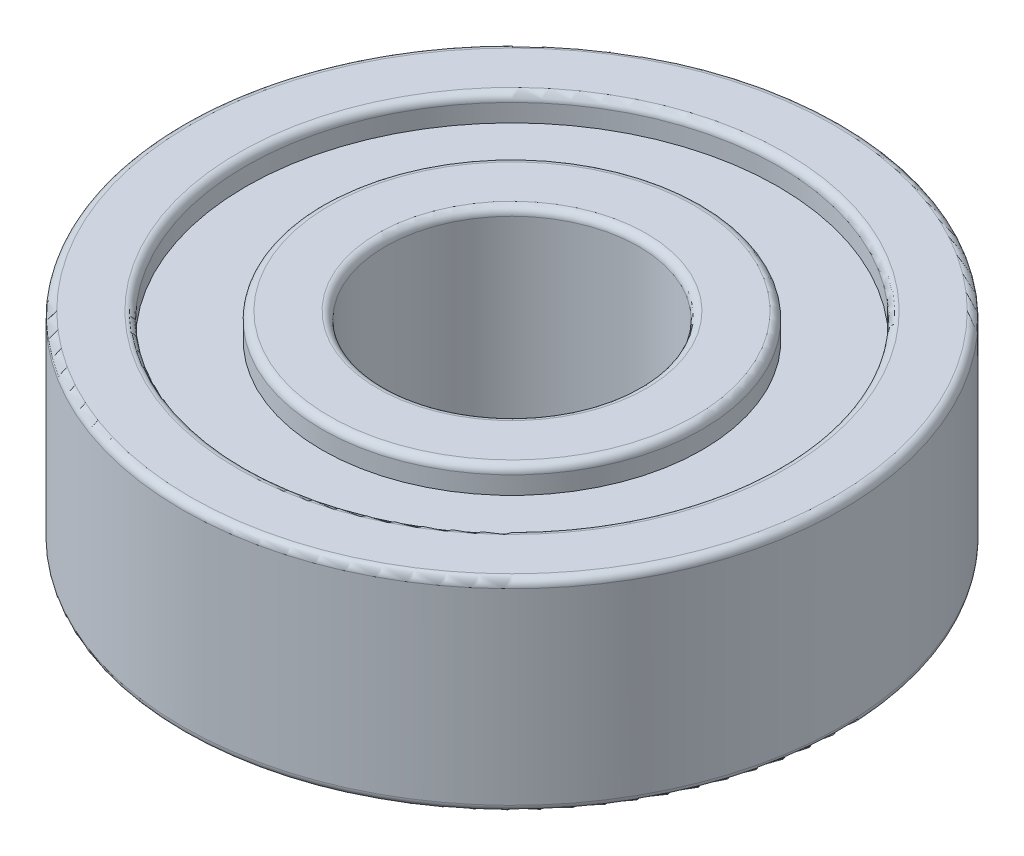
ISO-10303-21;
HEADER;
FILE_DESCRIPTION(('STEP AP214'),'2;1');
FILE_NAME('part.step','',(''),(''),'','','');
FILE_SCHEMA(('AUTOMOTIVE_DESIGN { 1 0 10303 214 1 1 1 1 }'));
ENDSEC;
DATA;
#1=APPLICATION_CONTEXT('core data for automotive mechanical design processes');
#2=APPLICATION_PROTOCOL_DEFINITION('international standard','automotive_design',2000,#1);
#3=PRODUCT_CONTEXT('',#1,'mechanical');
#4=PRODUCT('Part','Part','',(#3));
#5=PRODUCT_RELATED_PRODUCT_CATEGORY('part','',(#4));
#6=PRODUCT_DEFINITION_FORMATION('','',#4);
#7=PRODUCT_DEFINITION_CONTEXT('part definition',#1,'design');
#8=PRODUCT_DEFINITION('design','',#6,#7);
#9=PRODUCT_DEFINITION_SHAPE('','',#8);
#10=(LENGTH_UNIT() NAMED_UNIT(*) SI_UNIT(.MILLI.,.METRE.));
#11=(NAMED_UNIT(*) PLANE_ANGLE_UNIT() SI_UNIT($,.RADIAN.));
#12=(NAMED_UNIT(*) SI_UNIT($,.STERADIAN.) SOLID_ANGLE_UNIT());
#13=UNCERTAINTY_MEASURE_WITH_UNIT(LENGTH_MEASURE(1.E-05),#10,'distance_accuracy_value','');
#14=(GEOMETRIC_REPRESENTATION_CONTEXT(3) GLOBAL_UNCERTAINTY_ASSIGNED_CONTEXT((#13)) GLOBAL_UNIT_ASSIGNED_CONTEXT((#10,
#11,#12)) REPRESENTATION_CONTEXT('',''));
#15=CARTESIAN_POINT('',(0.,0.,0.));
#16=DIRECTION('',(0.,0.,1.));
#17=DIRECTION('',(1.,0.,0.));
#18=AXIS2_PLACEMENT_3D('',#15,#16,#17);
#19=CARTESIAN_POINT('',(7.5,8.,0.));
#20=DIRECTION('',(0.,-1.,0.));
#21=DIRECTION('',(0.,0.,-1.));
#22=AXIS2_PLACEMENT_3D('',#19,#20,#21);
#23=PLANE('',#22);
#24=CARTESIAN_POINT('',(0.,8.,0.));
#25=DIRECTION('',(0.,-1.,0.));
#26=DIRECTION('',(0.,0.,-1.));
#27=AXIS2_PLACEMENT_3D('',#24,#25,#26);
#28=CIRCLE('',#27,7.2);
#29=CARTESIAN_POINT('',(0.,8.,-7.2));
#30=VERTEX_POINT('',#29);
#31=EDGE_CURVE('E55',#30,#30,#28,.F.);
#32=ORIENTED_EDGE('',*,*,#31,.T.);
#33=EDGE_LOOP('',(#32));
#34=FACE_BOUND('',#33,.T.);
#35=CARTESIAN_POINT('',(0.,8.,0.));
#36=DIRECTION('',(0.,-1.,0.));
#37=DIRECTION('',(0.,0.,-1.));
#38=AXIS2_PLACEMENT_3D('',#35,#36,#37);
#39=CIRCLE('',#38,5.3);
#40=CARTESIAN_POINT('',(0.,8.,-5.3));
#41=VERTEX_POINT('',#40);
#42=EDGE_CURVE('E58',#41,#41,#39,.T.);
#43=ORIENTED_EDGE('',*,*,#42,.T.);
#44=EDGE_LOOP('',(#43));
#45=FACE_BOUND('',#44,.T.);
#46=ADVANCED_FACE('F35',(#34,#45),#23,.F.);
#47=CARTESIAN_POINT('',(0.,4.61129603751149,0.));
#48=DIRECTION('',(0.,1.,0.));
#49=DIRECTION('',(0.,0.,1.));
#50=AXIS2_PLACEMENT_3D('',#47,#48,#49);
#51=CYLINDRICAL_SURFACE('',#50,5.);
#52=CARTESIAN_POINT('',(0.,0.3,0.));
#53=DIRECTION('',(0.,1.,0.));
#54=DIRECTION('',(0.,0.,1.));
#55=AXIS2_PLACEMENT_3D('',#52,#53,#54);
#56=CIRCLE('',#55,5.);
#57=CARTESIAN_POINT('',(0.,0.3,5.));
#58=VERTEX_POINT('',#57);
#59=EDGE_CURVE('E79',#58,#58,#56,.F.);
#60=ORIENTED_EDGE('',*,*,#59,.T.);
#61=EDGE_LOOP('',(#60));
#62=FACE_BOUND('',#61,.T.);
#63=CARTESIAN_POINT('',(0.,7.7,0.));
#64=DIRECTION('',(0.,-1.,0.));
#65=DIRECTION('',(0.,0.,-1.));
#66=AXIS2_PLACEMENT_3D('',#63,#64,#65);
#67=CIRCLE('',#66,5.);
#68=CARTESIAN_POINT('',(0.,7.7,-5.));
#69=VERTEX_POINT('',#68);
#70=EDGE_CURVE('E82',#69,#69,#67,.F.);
#71=ORIENTED_EDGE('',*,*,#70,.T.);
#72=EDGE_LOOP('',(#71));
#73=FACE_BOUND('',#72,.T.);
#74=ADVANCED_FACE('F122',(#62,#73),#51,.F.);
#75=CARTESIAN_POINT('',(5.,0.,0.));
#76=DIRECTION('',(0.,1.,0.));
#77=DIRECTION('',(0.,0.,1.));
#78=AXIS2_PLACEMENT_3D('',#75,#76,#77);
#79=PLANE('',#78);
#80=CARTESIAN_POINT('',(0.,0.,0.));
#81=DIRECTION('',(0.,1.,0.));
#82=DIRECTION('',(0.,0.,1.));
#83=AXIS2_PLACEMENT_3D('',#80,#81,#82);
#84=CIRCLE('',#83,5.3);
#85=CARTESIAN_POINT('',(0.,0.,5.3));
#86=VERTEX_POINT('',#85);
#87=EDGE_CURVE('E85',#86,#86,#84,.T.);
#88=ORIENTED_EDGE('',*,*,#87,.T.);
#89=EDGE_LOOP('',(#88));
#90=FACE_BOUND('',#89,.T.);
#91=CARTESIAN_POINT('',(0.,0.,0.));
#92=DIRECTION('',(0.,1.,0.));
#93=DIRECTION('',(0.,0.,1.));
#94=AXIS2_PLACEMENT_3D('',#91,#92,#93);
#95=CIRCLE('',#94,7.2);
#96=CARTESIAN_POINT('',(0.,0.,7.2));
#97=VERTEX_POINT('',#96);
#98=EDGE_CURVE('E88',#97,#97,#95,.F.);
#99=ORIENTED_EDGE('',*,*,#98,.T.);
#100=EDGE_LOOP('',(#99));
#101=FACE_BOUND('',#100,.T.);
#102=ADVANCED_FACE('F128',(#90,#101),#79,.F.);
#103=CARTESIAN_POINT('',(0.,4.61129603751149,0.));
#104=DIRECTION('',(0.,1.,0.));
#105=DIRECTION('',(0.,0.,1.));
#106=AXIS2_PLACEMENT_3D('',#103,#104,#105);
#107=CYLINDRICAL_SURFACE('',#106,7.5);
#108=CARTESIAN_POINT('',(0.,0.3,0.));
#109=DIRECTION('',(0.,1.,0.));
#110=DIRECTION('',(0.,0.,1.));
#111=AXIS2_PLACEMENT_3D('',#108,#109,#110);
#112=CIRCLE('',#111,7.5);
#113=CARTESIAN_POINT('',(0.,0.3,7.5));
#114=VERTEX_POINT('',#113);
#115=EDGE_CURVE('E76',#114,#114,#112,.T.);
#116=ORIENTED_EDGE('',*,*,#115,.T.);
#117=EDGE_LOOP('',(#116));
#118=FACE_BOUND('',#117,.T.);
#119=CARTESIAN_POINT('',(0.,1.,0.));
#120=DIRECTION('',(0.,1.,0.));
#121=DIRECTION('',(0.,0.,1.));
#122=AXIS2_PLACEMENT_3D('',#119,#120,#121);
#123=CIRCLE('',#122,7.5);
#124=CARTESIAN_POINT('',(0.,1.,7.5));
#125=VERTEX_POINT('',#124);
#126=EDGE_CURVE('E91',#125,#125,#123,.T.);
#127=ORIENTED_EDGE('',*,*,#126,.F.);
#128=EDGE_LOOP('',(#127));
#129=FACE_BOUND('',#128,.T.);
#130=ADVANCED_FACE('F184',(#118,#129),#107,.T.);
#131=CARTESIAN_POINT('',(7.5,1.,0.));
#132=DIRECTION('',(0.,1.,0.));
#133=DIRECTION('',(0.,0.,1.));
#134=AXIS2_PLACEMENT_3D('',#131,#132,#133);
#135=PLANE('',#134);
#136=CARTESIAN_POINT('',(0.,1.,0.));
#137=DIRECTION('',(0.,1.,0.));
#138=DIRECTION('',(0.,0.,1.));
#139=AXIS2_PLACEMENT_3D('',#136,#137,#138);
#140=CIRCLE('',#139,10.5);
#141=CARTESIAN_POINT('',(0.,1.,10.5));
#142=VERTEX_POINT('',#141);
#143=EDGE_CURVE('E94',#142,#142,#140,.T.);
#144=ORIENTED_EDGE('',*,*,#143,.F.);
#145=EDGE_LOOP('',(#144));
#146=FACE_BOUND('',#145,.T.);
#147=ORIENTED_EDGE('',*,*,#126,.T.);
#148=EDGE_LOOP('',(#147));
#149=FACE_BOUND('',#148,.T.);
#150=ADVANCED_FACE('F180',(#146,#149),#135,.F.);
#151=CARTESIAN_POINT('',(0.,4.61129603751149,0.));
#152=DIRECTION('',(0.,1.,0.));
#153=DIRECTION('',(0.,0.,1.));
#154=AXIS2_PLACEMENT_3D('',#151,#152,#153);
#155=CYLINDRICAL_SURFACE('',#154,10.5);
#156=CARTESIAN_POINT('',(0.,0.3,0.));
#157=DIRECTION('',(0.,1.,0.));
#158=DIRECTION('',(0.,0.,1.));
#159=AXIS2_PLACEMENT_3D('',#156,#157,#158);
#160=CIRCLE('',#159,10.5);
#161=CARTESIAN_POINT('',(0.,0.3,10.5));
#162=VERTEX_POINT('',#161);
#163=EDGE_CURVE('E67',#162,#162,#160,.F.);
#164=ORIENTED_EDGE('',*,*,#163,.T.);
#165=EDGE_LOOP('',(#164));
#166=FACE_BOUND('',#165,.T.);
#167=ORIENTED_EDGE('',*,*,#143,.T.);
#168=EDGE_LOOP('',(#167));
#169=FACE_BOUND('',#168,.T.);
#170=ADVANCED_FACE('F174',(#166,#169),#155,.F.);
#171=CARTESIAN_POINT('',(10.5,0.,0.));
#172=DIRECTION('',(0.,1.,0.));
#173=DIRECTION('',(0.,0.,1.));
#174=AXIS2_PLACEMENT_3D('',#171,#172,#173);
#175=PLANE('',#174);
#176=CARTESIAN_POINT('',(0.,0.,0.));
#177=DIRECTION('',(0.,1.,0.));
#178=DIRECTION('',(0.,0.,1.));
#179=AXIS2_PLACEMENT_3D('',#176,#177,#178);
#180=CIRCLE('',#179,10.8);
#181=CARTESIAN_POINT('',(0.,0.,10.8));
#182=VERTEX_POINT('',#181);
#183=EDGE_CURVE('E70',#182,#182,#180,.T.);
#184=ORIENTED_EDGE('',*,*,#183,.T.);
#185=EDGE_LOOP('',(#184));
#186=FACE_BOUND('',#185,.T.);
#187=CARTESIAN_POINT('',(0.,0.,0.));
#188=DIRECTION('',(0.,1.,0.));
#189=DIRECTION('',(0.,0.,1.));
#190=AXIS2_PLACEMENT_3D('',#187,#188,#189);
#191=CIRCLE('',#190,12.7);
#192=CARTESIAN_POINT('',(0.,0.,12.7));
#193=VERTEX_POINT('',#192);
#194=EDGE_CURVE('E73',#193,#193,#191,.F.);
#195=ORIENTED_EDGE('',*,*,#194,.T.);
#196=EDGE_LOOP('',(#195));
#197=FACE_BOUND('',#196,.T.);
#198=ADVANCED_FACE('F168',(#186,#197),#175,.F.);
#199=CARTESIAN_POINT('',(0.,4.61129603751149,0.));
#200=DIRECTION('',(0.,1.,0.));
#201=DIRECTION('',(0.,0.,1.));
#202=AXIS2_PLACEMENT_3D('',#199,#200,#201);
#203=CYLINDRICAL_SURFACE('',#202,13.);
#204=CARTESIAN_POINT('',(0.,0.3,0.));
#205=DIRECTION('',(0.,1.,0.));
#206=DIRECTION('',(0.,0.,1.));
#207=AXIS2_PLACEMENT_3D('',#204,#205,#206);
#208=CIRCLE('',#207,13.);
#209=CARTESIAN_POINT('',(0.,0.3,13.));
#210=VERTEX_POINT('',#209);
#211=EDGE_CURVE('E61',#210,#210,#208,.T.);
#212=ORIENTED_EDGE('',*,*,#211,.T.);
#213=EDGE_LOOP('',(#212));
#214=FACE_BOUND('',#213,.T.);
#215=CARTESIAN_POINT('',(0.,7.7,0.));
#216=DIRECTION('',(0.,-1.,0.));
#217=DIRECTION('',(0.,0.,-1.));
#218=AXIS2_PLACEMENT_3D('',#215,#216,#217);
#219=CIRCLE('',#218,13.);
#220=CARTESIAN_POINT('',(0.,7.7,-13.));
#221=VERTEX_POINT('',#220);
#222=EDGE_CURVE('E64',#221,#221,#219,.T.);
#223=ORIENTED_EDGE('',*,*,#222,.T.);
#224=EDGE_LOOP('',(#223));
#225=FACE_BOUND('',#224,.T.);
#226=ADVANCED_FACE('F119',(#214,#225),#203,.T.);
#227=CARTESIAN_POINT('',(13.,8.,0.));
#228=DIRECTION('',(0.,-1.,0.));
#229=DIRECTION('',(0.,0.,-1.));
#230=AXIS2_PLACEMENT_3D('',#227,#228,#229);
#231=PLANE('',#230);
#232=CARTESIAN_POINT('',(0.,8.,0.));
#233=DIRECTION('',(0.,-1.,0.));
#234=DIRECTION('',(0.,0.,-1.));
#235=AXIS2_PLACEMENT_3D('',#232,#233,#234);
#236=CIRCLE('',#235,12.7);
#237=CARTESIAN_POINT('',(0.,8.,-12.7));
#238=VERTEX_POINT('',#237);
#239=EDGE_CURVE('E42',#238,#238,#236,.F.);
#240=ORIENTED_EDGE('',*,*,#239,.T.);
#241=EDGE_LOOP('',(#240));
#242=FACE_BOUND('',#241,.T.);
#243=CARTESIAN_POINT('',(0.,8.,0.));
#244=DIRECTION('',(0.,-1.,0.));
#245=DIRECTION('',(0.,0.,-1.));
#246=AXIS2_PLACEMENT_3D('',#243,#244,#245);
#247=CIRCLE('',#246,10.8);
#248=CARTESIAN_POINT('',(0.,8.,-10.8));
#249=VERTEX_POINT('',#248);
#250=EDGE_CURVE('E46',#249,#249,#247,.T.);
#251=ORIENTED_EDGE('',*,*,#250,.T.);
#252=EDGE_LOOP('',(#251));
#253=FACE_BOUND('',#252,.T.);
#254=ADVANCED_FACE('F114',(#242,#253),#231,.F.);
#255=CARTESIAN_POINT('',(0.,4.61129603751149,0.));
#256=DIRECTION('',(0.,1.,0.));
#257=DIRECTION('',(0.,0.,1.));
#258=AXIS2_PLACEMENT_3D('',#255,#256,#257);
#259=CYLINDRICAL_SURFACE('',#258,10.5);
#260=CARTESIAN_POINT('',(0.,7.7,0.));
#261=DIRECTION('',(0.,-1.,0.));
#262=DIRECTION('',(0.,0.,-1.));
#263=AXIS2_PLACEMENT_3D('',#260,#261,#262);
#264=CIRCLE('',#263,10.5);
#265=CARTESIAN_POINT('',(0.,7.7,-10.5));
#266=VERTEX_POINT('',#265);
#267=EDGE_CURVE('E10',#266,#266,#264,.F.);
#268=ORIENTED_EDGE('',*,*,#267,.T.);
#269=EDGE_LOOP('',(#268));
#270=FACE_BOUND('',#269,.T.);
#271=CARTESIAN_POINT('',(0.,7.,0.));
#272=DIRECTION('',(0.,1.,0.));
#273=DIRECTION('',(0.,0.,1.));
#274=AXIS2_PLACEMENT_3D('',#271,#272,#273);
#275=CIRCLE('',#274,10.5);
#276=CARTESIAN_POINT('',(0.,7.,10.5));
#277=VERTEX_POINT('',#276);
#278=EDGE_CURVE('E97',#277,#277,#275,.T.);
#279=ORIENTED_EDGE('',*,*,#278,.F.);
#280=EDGE_LOOP('',(#279));
#281=FACE_BOUND('',#280,.T.);
#282=ADVANCED_FACE('F109',(#270,#281),#259,.F.);
#283=CARTESIAN_POINT('',(10.5,7.,0.));
#284=DIRECTION('',(0.,-1.,0.));
#285=DIRECTION('',(0.,0.,-1.));
#286=AXIS2_PLACEMENT_3D('',#283,#284,#285);
#287=PLANE('',#286);
#288=CARTESIAN_POINT('',(0.,7.,0.));
#289=DIRECTION('',(0.,1.,0.));
#290=DIRECTION('',(0.,0.,1.));
#291=AXIS2_PLACEMENT_3D('',#288,#289,#290);
#292=CIRCLE('',#291,7.5);
#293=CARTESIAN_POINT('',(0.,7.,7.5));
#294=VERTEX_POINT('',#293);
#295=EDGE_CURVE('E100',#294,#294,#292,.T.);
#296=ORIENTED_EDGE('',*,*,#295,.F.);
#297=EDGE_LOOP('',(#296));
#298=FACE_BOUND('',#297,.T.);
#299=ORIENTED_EDGE('',*,*,#278,.T.);
#300=EDGE_LOOP('',(#299));
#301=FACE_BOUND('',#300,.T.);
#302=ADVANCED_FACE('F106',(#298,#301),#287,.F.);
#303=CARTESIAN_POINT('',(0.,4.61129603751149,0.));
#304=DIRECTION('',(0.,1.,0.));
#305=DIRECTION('',(0.,0.,1.));
#306=AXIS2_PLACEMENT_3D('',#303,#304,#305);
#307=CYLINDRICAL_SURFACE('',#306,7.5);
#308=CARTESIAN_POINT('',(0.,7.7,0.));
#309=DIRECTION('',(0.,-1.,0.));
#310=DIRECTION('',(0.,0.,-1.));
#311=AXIS2_PLACEMENT_3D('',#308,#309,#310);
#312=CIRCLE('',#311,7.5);
#313=CARTESIAN_POINT('',(0.,7.7,-7.5));
#314=VERTEX_POINT('',#313);
#315=EDGE_CURVE('E50',#314,#314,#312,.T.);
#316=ORIENTED_EDGE('',*,*,#315,.T.);
#317=EDGE_LOOP('',(#316));
#318=FACE_BOUND('',#317,.T.);
#319=ORIENTED_EDGE('',*,*,#295,.T.);
#320=EDGE_LOOP('',(#319));
#321=FACE_BOUND('',#320,.T.);
#322=ADVANCED_FACE('F104',(#318,#321),#307,.T.);
#323=CARTESIAN_POINT('',(0.,0.3,0.));
#324=DIRECTION('',(0.,1.,0.));
#325=DIRECTION('',(0.,0.,1.));
#326=AXIS2_PLACEMENT_3D('',#323,#324,#325);
#327=TOROIDAL_SURFACE('',#326,5.3,0.3);
#328=ORIENTED_EDGE('',*,*,#59,.F.);
#329=EDGE_LOOP('',(#328));
#330=FACE_BOUND('',#329,.T.);
#331=ORIENTED_EDGE('',*,*,#87,.F.);
#332=EDGE_LOOP('',(#331));
#333=FACE_BOUND('',#332,.T.);
#334=ADVANCED_FACE('F134',(#330,#333),#327,.T.);
#335=CARTESIAN_POINT('',(0.,0.3,0.));
#336=DIRECTION('',(0.,1.,0.));
#337=DIRECTION('',(0.,0.,1.));
#338=AXIS2_PLACEMENT_3D('',#335,#336,#337);
#339=TOROIDAL_SURFACE('',#338,7.2,0.3);
#340=ORIENTED_EDGE('',*,*,#98,.F.);
#341=EDGE_LOOP('',(#340));
#342=FACE_BOUND('',#341,.T.);
#343=ORIENTED_EDGE('',*,*,#115,.F.);
#344=EDGE_LOOP('',(#343));
#345=FACE_BOUND('',#344,.T.);
#346=ADVANCED_FACE('F137',(#342,#345),#339,.T.);
#347=CARTESIAN_POINT('',(0.,0.3,0.));
#348=DIRECTION('',(0.,1.,0.));
#349=DIRECTION('',(0.,0.,1.));
#350=AXIS2_PLACEMENT_3D('',#347,#348,#349);
#351=TOROIDAL_SURFACE('',#350,10.8,0.3);
#352=ORIENTED_EDGE('',*,*,#163,.F.);
#353=EDGE_LOOP('',(#352));
#354=FACE_BOUND('',#353,.T.);
#355=ORIENTED_EDGE('',*,*,#183,.F.);
#356=EDGE_LOOP('',(#355));
#357=FACE_BOUND('',#356,.T.);
#358=ADVANCED_FACE('F141',(#354,#357),#351,.T.);
#359=CARTESIAN_POINT('',(0.,0.3,0.));
#360=DIRECTION('',(0.,1.,0.));
#361=DIRECTION('',(0.,0.,1.));
#362=AXIS2_PLACEMENT_3D('',#359,#360,#361);
#363=TOROIDAL_SURFACE('',#362,12.7,0.3);
#364=ORIENTED_EDGE('',*,*,#194,.F.);
#365=EDGE_LOOP('',(#364));
#366=FACE_BOUND('',#365,.T.);
#367=ORIENTED_EDGE('',*,*,#211,.F.);
#368=EDGE_LOOP('',(#367));
#369=FACE_BOUND('',#368,.T.);
#370=ADVANCED_FACE('F145',(#366,#369),#363,.T.);
#371=CARTESIAN_POINT('',(0.,7.7,0.));
#372=DIRECTION('',(0.,-1.,0.));
#373=DIRECTION('',(0.,0.,-1.));
#374=AXIS2_PLACEMENT_3D('',#371,#372,#373);
#375=TOROIDAL_SURFACE('',#374,7.2,0.3);
#376=ORIENTED_EDGE('',*,*,#315,.F.);
#377=EDGE_LOOP('',(#376));
#378=FACE_BOUND('',#377,.T.);
#379=ORIENTED_EDGE('',*,*,#31,.F.);
#380=EDGE_LOOP('',(#379));
#381=FACE_BOUND('',#380,.T.);
#382=ADVANCED_FACE('F149',(#378,#381),#375,.T.);
#383=CARTESIAN_POINT('',(0.,7.7,0.));
#384=DIRECTION('',(0.,-1.,0.));
#385=DIRECTION('',(0.,0.,-1.));
#386=AXIS2_PLACEMENT_3D('',#383,#384,#385);
#387=TOROIDAL_SURFACE('',#386,5.3,0.3);
#388=ORIENTED_EDGE('',*,*,#42,.F.);
#389=EDGE_LOOP('',(#388));
#390=FACE_BOUND('',#389,.T.);
#391=ORIENTED_EDGE('',*,*,#70,.F.);
#392=EDGE_LOOP('',(#391));
#393=FACE_BOUND('',#392,.T.);
#394=ADVANCED_FACE('F153',(#390,#393),#387,.T.);
#395=CARTESIAN_POINT('',(0.,7.7,0.));
#396=DIRECTION('',(0.,-1.,0.));
#397=DIRECTION('',(0.,0.,-1.));
#398=AXIS2_PLACEMENT_3D('',#395,#396,#397);
#399=TOROIDAL_SURFACE('',#398,12.7,0.3);
#400=ORIENTED_EDGE('',*,*,#222,.F.);
#401=EDGE_LOOP('',(#400));
#402=FACE_BOUND('',#401,.T.);
#403=ORIENTED_EDGE('',*,*,#239,.F.);
#404=EDGE_LOOP('',(#403));
#405=FACE_BOUND('',#404,.T.);
#406=ADVANCED_FACE('F156',(#402,#405),#399,.T.);
#407=CARTESIAN_POINT('',(0.,7.7,0.));
#408=DIRECTION('',(0.,-1.,0.));
#409=DIRECTION('',(0.,0.,-1.));
#410=AXIS2_PLACEMENT_3D('',#407,#408,#409);
#411=TOROIDAL_SURFACE('',#410,10.8,0.3);
#412=ORIENTED_EDGE('',*,*,#250,.F.);
#413=EDGE_LOOP('',(#412));
#414=FACE_BOUND('',#413,.T.);
#415=ORIENTED_EDGE('',*,*,#267,.F.);
#416=EDGE_LOOP('',(#415));
#417=FACE_BOUND('',#416,.T.);
#418=ADVANCED_FACE('F37',(#414,#417),#411,.T.);
#419=CLOSED_SHELL('',(#46,#74,#102,#130,#150,#170,#198,#226,#254,#282,#302,#322,#334,#346,#358,
#370,#382,#394,#406,#418));
#420=MANIFOLD_SOLID_BREP('B2',#419);
#421=ADVANCED_BREP_SHAPE_REPRESENTATION('',(#18,#420),#14);
#422=SHAPE_DEFINITION_REPRESENTATION(#9,#421);
ENDSEC;
END-ISO-10303-21;
